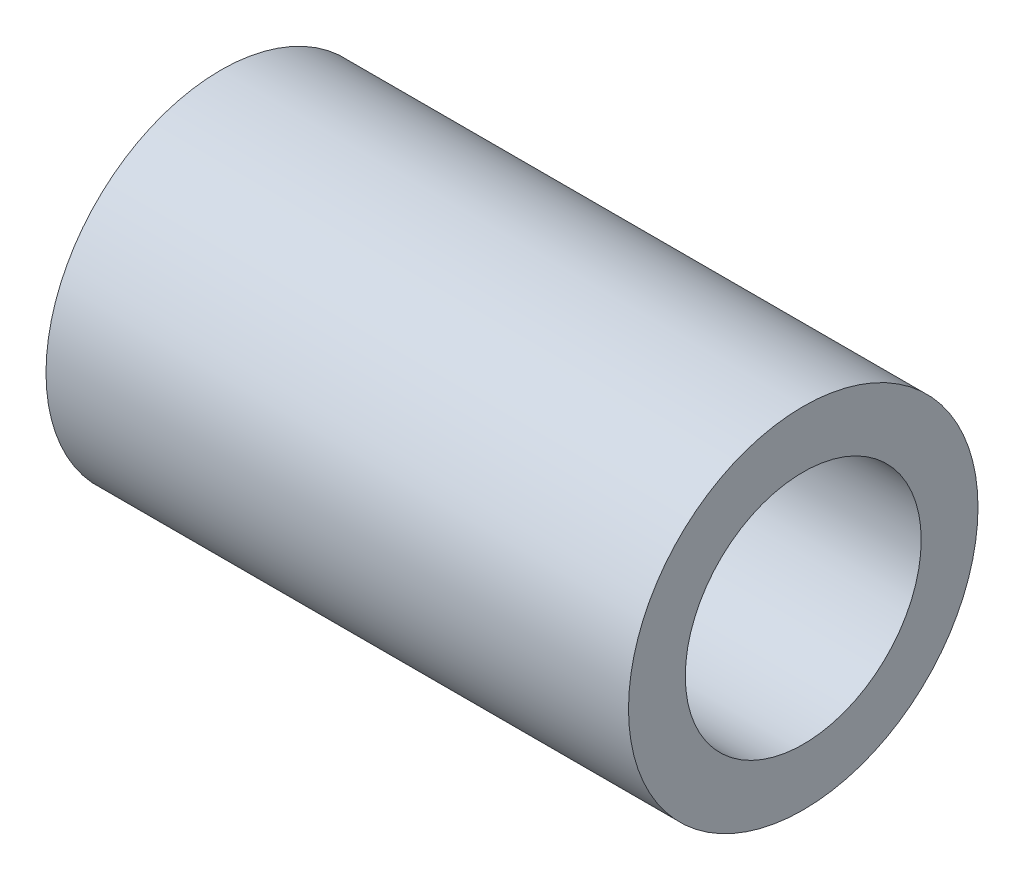
ISO-10303-21;
HEADER;
FILE_DESCRIPTION(('STEP AP214'),'2;1');
FILE_NAME('part.step','',(''),(''),'','','');
FILE_SCHEMA(('AUTOMOTIVE_DESIGN { 1 0 10303 214 1 1 1 1 }'));
ENDSEC;
DATA;
#1=APPLICATION_CONTEXT('core data for automotive mechanical design processes');
#2=APPLICATION_PROTOCOL_DEFINITION('international standard','automotive_design',2000,#1);
#3=PRODUCT_CONTEXT('',#1,'mechanical');
#4=PRODUCT('Part','Part','',(#3));
#5=PRODUCT_RELATED_PRODUCT_CATEGORY('part','',(#4));
#6=PRODUCT_DEFINITION_FORMATION('','',#4);
#7=PRODUCT_DEFINITION_CONTEXT('part definition',#1,'design');
#8=PRODUCT_DEFINITION('design','',#6,#7);
#9=PRODUCT_DEFINITION_SHAPE('','',#8);
#10=(LENGTH_UNIT() NAMED_UNIT(*) SI_UNIT(.MILLI.,.METRE.));
#11=(NAMED_UNIT(*) PLANE_ANGLE_UNIT() SI_UNIT($,.RADIAN.));
#12=(NAMED_UNIT(*) SI_UNIT($,.STERADIAN.) SOLID_ANGLE_UNIT());
#13=UNCERTAINTY_MEASURE_WITH_UNIT(LENGTH_MEASURE(1.E-05),#10,'distance_accuracy_value','');
#14=(GEOMETRIC_REPRESENTATION_CONTEXT(3) GLOBAL_UNCERTAINTY_ASSIGNED_CONTEXT((#13)) GLOBAL_UNIT_ASSIGNED_CONTEXT((#10,
#11,#12)) REPRESENTATION_CONTEXT('',''));
#15=CARTESIAN_POINT('',(0.,0.,0.));
#16=DIRECTION('',(0.,0.,1.));
#17=DIRECTION('',(1.,0.,0.));
#18=AXIS2_PLACEMENT_3D('',#15,#16,#17);
#19=CARTESIAN_POINT('',(48.708348754,-9.,-28.));
#20=DIRECTION('',(-1.,0.,0.));
#21=DIRECTION('',(0.,0.,1.));
#22=AXIS2_PLACEMENT_3D('',#19,#20,#21);
#23=CYLINDRICAL_SURFACE('',#22,6.);
#24=CARTESIAN_POINT('',(48.708348754,-9.,-28.));
#25=DIRECTION('',(1.,0.,0.));
#26=DIRECTION('',(0.,0.,-1.));
#27=AXIS2_PLACEMENT_3D('',#24,#25,#26);
#28=CIRCLE('',#27,6.);
#29=CARTESIAN_POINT('',(48.708348754,-9.,-34.));
#30=VERTEX_POINT('',#29);
#31=EDGE_CURVE('E10',#30,#30,#28,.T.);
#32=ORIENTED_EDGE('',*,*,#31,.F.);
#33=EDGE_LOOP('',(#32));
#34=FACE_BOUND('',#33,.T.);
#35=CARTESIAN_POINT('',(28.708348754,-9.,-28.));
#36=DIRECTION('',(1.,0.,0.));
#37=DIRECTION('',(0.,0.,-1.));
#38=AXIS2_PLACEMENT_3D('',#35,#36,#37);
#39=CIRCLE('',#38,6.);
#40=CARTESIAN_POINT('',(28.708348754,-9.,-34.));
#41=VERTEX_POINT('',#40);
#42=EDGE_CURVE('E46',#41,#41,#39,.T.);
#43=ORIENTED_EDGE('',*,*,#42,.T.);
#44=EDGE_LOOP('',(#43));
#45=FACE_BOUND('',#44,.T.);
#46=ADVANCED_FACE('F39',(#34,#45),#23,.T.);
#47=CARTESIAN_POINT('',(48.708348754,-9.,-28.));
#48=DIRECTION('',(1.,0.,0.));
#49=DIRECTION('',(0.,0.,-1.));
#50=AXIS2_PLACEMENT_3D('',#47,#48,#49);
#51=PLANE('',#50);
#52=CARTESIAN_POINT('',(48.708348754,-9.,-28.));
#53=DIRECTION('',(1.,0.,0.));
#54=DIRECTION('',(0.,0.,-1.));
#55=AXIS2_PLACEMENT_3D('',#52,#53,#54);
#56=CIRCLE('',#55,4.05);
#57=CARTESIAN_POINT('',(48.708348754,-9.,-32.05));
#58=VERTEX_POINT('',#57);
#59=EDGE_CURVE('E51',#58,#58,#56,.F.);
#60=ORIENTED_EDGE('',*,*,#59,.T.);
#61=EDGE_LOOP('',(#60));
#62=FACE_BOUND('',#61,.T.);
#63=ORIENTED_EDGE('',*,*,#31,.T.);
#64=EDGE_LOOP('',(#63));
#65=FACE_BOUND('',#64,.T.);
#66=ADVANCED_FACE('F63',(#62,#65),#51,.T.);
#67=CARTESIAN_POINT('',(28.708348754,-9.,-28.));
#68=DIRECTION('',(1.,0.,0.));
#69=DIRECTION('',(0.,0.,-1.));
#70=AXIS2_PLACEMENT_3D('',#67,#68,#69);
#71=PLANE('',#70);
#72=CARTESIAN_POINT('',(28.708348754,-9.,-28.));
#73=DIRECTION('',(1.,0.,0.));
#74=DIRECTION('',(0.,0.,-1.));
#75=AXIS2_PLACEMENT_3D('',#72,#73,#74);
#76=CIRCLE('',#75,4.05);
#77=CARTESIAN_POINT('',(28.708348754,-9.,-32.05));
#78=VERTEX_POINT('',#77);
#79=EDGE_CURVE('E45',#78,#78,#76,.F.);
#80=ORIENTED_EDGE('',*,*,#79,.F.);
#81=EDGE_LOOP('',(#80));
#82=FACE_BOUND('',#81,.T.);
#83=ORIENTED_EDGE('',*,*,#42,.F.);
#84=EDGE_LOOP('',(#83));
#85=FACE_BOUND('',#84,.T.);
#86=ADVANCED_FACE('F61',(#82,#85),#71,.F.);
#87=CARTESIAN_POINT('',(48.808348754,-9.,-28.));
#88=DIRECTION('',(-1.,0.,0.));
#89=DIRECTION('',(0.,0.,1.));
#90=AXIS2_PLACEMENT_3D('',#87,#88,#89);
#91=CYLINDRICAL_SURFACE('',#90,4.05);
#92=ORIENTED_EDGE('',*,*,#59,.F.);
#93=EDGE_LOOP('',(#92));
#94=FACE_BOUND('',#93,.T.);
#95=ORIENTED_EDGE('',*,*,#79,.T.);
#96=EDGE_LOOP('',(#95));
#97=FACE_BOUND('',#96,.T.);
#98=ADVANCED_FACE('F56',(#94,#97),#91,.F.);
#99=CLOSED_SHELL('',(#46,#66,#86,#98));
#100=MANIFOLD_SOLID_BREP('B2',#99);
#101=ADVANCED_BREP_SHAPE_REPRESENTATION('',(#18,#100),#14);
#102=SHAPE_DEFINITION_REPRESENTATION(#9,#101);
ENDSEC;
END-ISO-10303-21;
